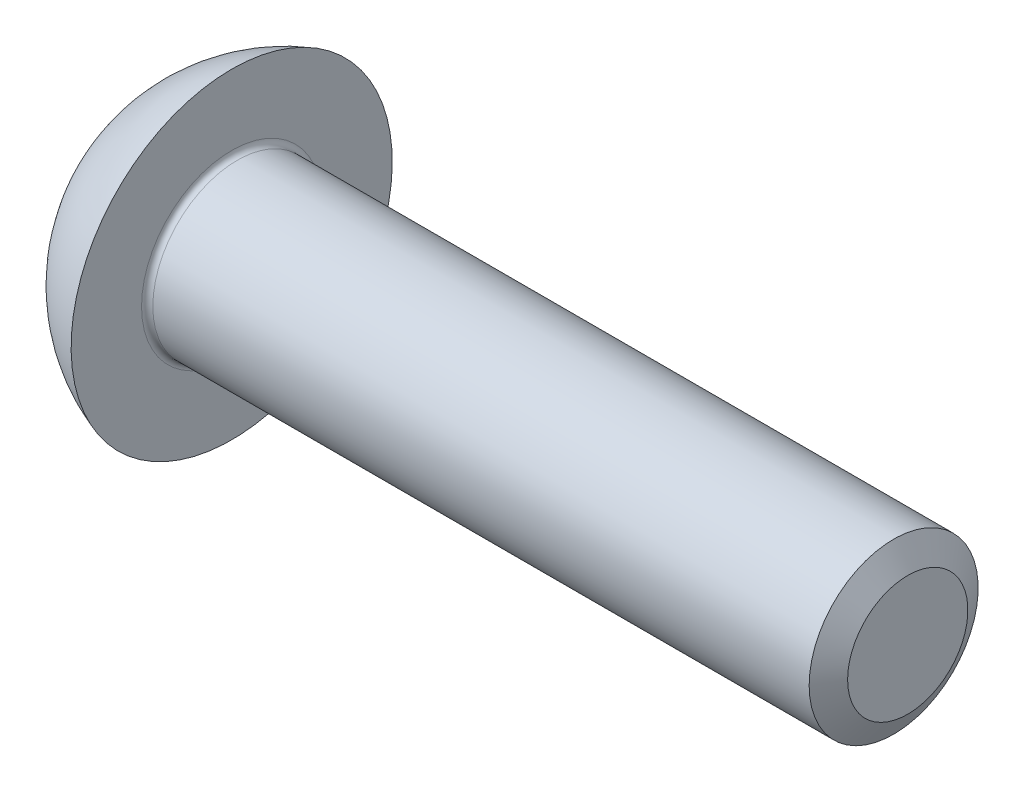
ISO-10303-21;
HEADER;
FILE_DESCRIPTION(('STEP AP214'),'2;1');
FILE_NAME('part.step','',(''),(''),'','','');
FILE_SCHEMA(('AUTOMOTIVE_DESIGN { 1 0 10303 214 1 1 1 1 }'));
ENDSEC;
DATA;
#1=APPLICATION_CONTEXT('core data for automotive mechanical design processes');
#2=APPLICATION_PROTOCOL_DEFINITION('international standard','automotive_design',2000,#1);
#3=PRODUCT_CONTEXT('',#1,'mechanical');
#4=PRODUCT('Part','Part','',(#3));
#5=PRODUCT_RELATED_PRODUCT_CATEGORY('part','',(#4));
#6=PRODUCT_DEFINITION_FORMATION('','',#4);
#7=PRODUCT_DEFINITION_CONTEXT('part definition',#1,'design');
#8=PRODUCT_DEFINITION('design','',#6,#7);
#9=PRODUCT_DEFINITION_SHAPE('','',#8);
#10=(LENGTH_UNIT() NAMED_UNIT(*) SI_UNIT(.MILLI.,.METRE.));
#11=(NAMED_UNIT(*) PLANE_ANGLE_UNIT() SI_UNIT($,.RADIAN.));
#12=(NAMED_UNIT(*) SI_UNIT($,.STERADIAN.) SOLID_ANGLE_UNIT());
#13=UNCERTAINTY_MEASURE_WITH_UNIT(LENGTH_MEASURE(1.E-05),#10,'distance_accuracy_value','');
#14=(GEOMETRIC_REPRESENTATION_CONTEXT(3) GLOBAL_UNCERTAINTY_ASSIGNED_CONTEXT((#13)) GLOBAL_UNIT_ASSIGNED_CONTEXT((#10,
#11,#12)) REPRESENTATION_CONTEXT('',''));
#15=CARTESIAN_POINT('',(0.,0.,0.));
#16=DIRECTION('',(0.,0.,1.));
#17=DIRECTION('',(1.,0.,0.));
#18=AXIS2_PLACEMENT_3D('',#15,#16,#17);
#19=CARTESIAN_POINT('',(-13.65,0.,0.));
#20=DIRECTION('',(-1.,0.,0.));
#21=DIRECTION('',(0.,0.,1.));
#22=AXIS2_PLACEMENT_3D('',#19,#20,#21);
#23=CYLINDRICAL_SURFACE('',#22,1.5);
#24=CARTESIAN_POINT('',(-11.9,0.,0.));
#25=DIRECTION('',(-1.,0.,0.));
#26=DIRECTION('',(0.,0.,1.));
#27=AXIS2_PLACEMENT_3D('',#24,#25,#26);
#28=CIRCLE('',#27,1.5);
#29=CARTESIAN_POINT('',(-11.9,0.,1.5));
#30=VERTEX_POINT('',#29);
#31=EDGE_CURVE('E259',#30,#30,#28,.T.);
#32=ORIENTED_EDGE('',*,*,#31,.F.);
#33=EDGE_LOOP('',(#32));
#34=FACE_BOUND('',#33,.T.);
#35=CARTESIAN_POINT('',(-0.25,0.,0.));
#36=DIRECTION('',(-1.,0.,0.));
#37=DIRECTION('',(0.,0.,1.));
#38=AXIS2_PLACEMENT_3D('',#35,#36,#37);
#39=CIRCLE('',#38,1.5);
#40=CARTESIAN_POINT('',(-0.25,0.,1.5));
#41=VERTEX_POINT('',#40);
#42=EDGE_CURVE('E405',#41,#41,#39,.T.);
#43=ORIENTED_EDGE('',*,*,#42,.T.);
#44=EDGE_LOOP('',(#43));
#45=FACE_BOUND('',#44,.T.);
#46=ADVANCED_FACE('F38',(#34,#45),#23,.T.);
#47=CARTESIAN_POINT('',(-13.65,0.,0.));
#48=DIRECTION('',(1.,0.,0.));
#49=DIRECTION('',(0.,0.,-1.));
#50=AXIS2_PLACEMENT_3D('',#47,#48,#49);
#51=PLANE('',#50);
#52=CARTESIAN_POINT('',(-13.65,0.,0.));
#53=DIRECTION('',(-1.,0.,0.));
#54=DIRECTION('',(0.,0.,1.));
#55=AXIS2_PLACEMENT_3D('',#52,#53,#54);
#56=CIRCLE('',#55,1.5);
#57=CARTESIAN_POINT('',(-13.65,1.5,0.));
#58=VERTEX_POINT('',#57);
#59=EDGE_CURVE('E251',#58,#58,#56,.T.);
#60=ORIENTED_EDGE('',*,*,#59,.T.);
#61=EDGE_LOOP('',(#60));
#62=FACE_BOUND('',#61,.T.);
#63=CARTESIAN_POINT('',(-13.65,0.,0.));
#64=DIRECTION('',(1.,0.,0.));
#65=DIRECTION('',(0.,0.,-1.));
#66=AXIS2_PLACEMENT_3D('',#63,#64,#65);
#67=CIRCLE('',#66,1.15470053837925);
#68=CARTESIAN_POINT('',(-13.65,-0.577350269189626,-1.));
#69=VERTEX_POINT('',#68);
#70=CARTESIAN_POINT('',(-13.65,-1.15470053837925,0.));
#71=VERTEX_POINT('',#70);
#72=EDGE_CURVE('E11',#69,#71,#67,.F.);
#73=ORIENTED_EDGE('',*,*,#72,.F.);
#74=CARTESIAN_POINT('',(-13.65,0.577350269189626,-1.));
#75=VERTEX_POINT('',#74);
#76=EDGE_CURVE('E42',#75,#69,#67,.F.);
#77=ORIENTED_EDGE('',*,*,#76,.F.);
#78=CARTESIAN_POINT('',(-13.65,1.15470053837925,0.));
#79=VERTEX_POINT('',#78);
#80=EDGE_CURVE('E111',#79,#75,#67,.F.);
#81=ORIENTED_EDGE('',*,*,#80,.F.);
#82=CARTESIAN_POINT('',(-13.65,0.,0.));
#83=DIRECTION('',(-1.,0.,0.));
#84=DIRECTION('',(0.,0.,1.));
#85=AXIS2_PLACEMENT_3D('',#82,#83,#84);
#86=CIRCLE('',#85,1.15470053837925);
#87=CARTESIAN_POINT('',(-13.65,0.577350269189627,1.));
#88=VERTEX_POINT('',#87);
#89=EDGE_CURVE('E131',#88,#79,#86,.T.);
#90=ORIENTED_EDGE('',*,*,#89,.F.);
#91=CARTESIAN_POINT('',(-13.65,-0.577350269189627,1.));
#92=VERTEX_POINT('',#91);
#93=EDGE_CURVE('E325',#92,#88,#67,.F.);
#94=ORIENTED_EDGE('',*,*,#93,.F.);
#95=EDGE_CURVE('E47',#71,#92,#67,.F.);
#96=ORIENTED_EDGE('',*,*,#95,.F.);
#97=EDGE_LOOP('',(#73,#77,#81,#90,#94,#96));
#98=FACE_BOUND('',#97,.T.);
#99=ADVANCED_FACE('F40',(#62,#98),#51,.F.);
#100=CARTESIAN_POINT('',(-11.0454545454545,0.,0.));
#101=DIRECTION('',(-1.,0.,0.));
#102=DIRECTION('',(0.,1.,0.));
#103=AXIS2_PLACEMENT_3D('',#100,#101,#102);
#104=SPHERICAL_SURFACE('',#103,3.00560426949281);
#105=CARTESIAN_POINT('',(-12.,0.,0.));
#106=DIRECTION('',(-1.,0.,0.));
#107=DIRECTION('',(0.,0.,1.));
#108=AXIS2_PLACEMENT_3D('',#105,#106,#107);
#109=CIRCLE('',#108,2.85);
#110=CARTESIAN_POINT('',(-12.,2.85,0.));
#111=VERTEX_POINT('',#110);
#112=EDGE_CURVE('E254',#111,#111,#109,.T.);
#113=CARTESIAN_POINT('',(-13.65,1.5,0.));
#114=CARTESIAN_POINT('',(-13.6386705331495,1.51967216925548,0.));
#115=CARTESIAN_POINT('',(-13.6271181108235,1.53921593268643,0.));
#116=CARTESIAN_POINT('',(-13.6035734644196,1.57803672196104,0.));
#117=CARTESIAN_POINT('',(-13.5915812403415,1.59731374780469,0.));
#118=CARTESIAN_POINT('',(-13.5671630996322,1.6355911359664,0.));
#119=CARTESIAN_POINT('',(-13.554737183001,1.65459149828447,0.));
#120=CARTESIAN_POINT('',(-13.5294580495481,1.69230581219271,0.));
#121=CARTESIAN_POINT('',(-13.5166048327265,1.7110197637829,0.));
#122=CARTESIAN_POINT('',(-13.4904776944242,1.74815164624667,0.));
#123=CARTESIAN_POINT('',(-13.4772037729434,1.76656957712027,0.));
#124=CARTESIAN_POINT('',(-13.4502420411911,1.80309996277641,0.));
#125=CARTESIAN_POINT('',(-13.4365542309196,1.82121241755895,0.));
#126=CARTESIAN_POINT('',(-13.4087717487848,1.85712255178676,0.));
#127=CARTESIAN_POINT('',(-13.3946770769215,1.87492023123203,0.));
#128=CARTESIAN_POINT('',(-13.366088108,1.91019167733672,0.));
#129=CARTESIAN_POINT('',(-13.3515938109419,1.92766544399614,0.));
#130=CARTESIAN_POINT('',(-13.3222130331156,1.96228009332959,0.));
#131=CARTESIAN_POINT('',(-13.3073265523475,1.97942097600363,0.));
#132=CARTESIAN_POINT('',(-13.2771690499588,2.013361057086,0.));
#133=CARTESIAN_POINT('',(-13.2618980283382,2.03016025549433,0.));
#134=CARTESIAN_POINT('',(-13.2309792845233,2.06340834318511,0.));
#135=CARTESIAN_POINT('',(-13.2153315623289,2.07985723246756,0.));
#136=CARTESIAN_POINT('',(-13.1836674510477,2.11239625689921,0.));
#137=CARTESIAN_POINT('',(-13.1676510619609,2.12848639204841,0.));
#138=CARTESIAN_POINT('',(-13.1352578398529,2.16029964739354,0.));
#139=CARTESIAN_POINT('',(-13.1188810068317,2.17602276758948,0.));
#140=CARTESIAN_POINT('',(-13.0857753048683,2.2070939206369,0.));
#141=CARTESIAN_POINT('',(-13.069046435926,2.22244195348839,0.));
#142=CARTESIAN_POINT('',(-13.0352452508718,2.25275505202893,0.));
#143=CARTESIAN_POINT('',(-13.01817293476,2.26772011771799,0.));
#144=CARTESIAN_POINT('',(-12.9836936204474,2.29725959873447,0.));
#145=CARTESIAN_POINT('',(-12.9662866222466,2.3118340140619,0.));
#146=CARTESIAN_POINT('',(-12.9311468806653,2.34058471171934,0.));
#147=CARTESIAN_POINT('',(-12.9134141372848,2.35476099404935,0.));
#148=CARTESIAN_POINT('',(-12.8776320094939,2.38270814748122,0.));
#149=CARTESIAN_POINT('',(-12.8595826250834,2.39647901858308,0.));
#150=CARTESIAN_POINT('',(-12.8231764819488,2.42360827946968,0.));
#151=CARTESIAN_POINT('',(-12.8048197232246,2.43696666925442,0.));
#152=CARTESIAN_POINT('',(-12.7678082559874,2.46326410918943,0.));
#153=CARTESIAN_POINT('',(-12.7491535474743,2.4762031593397,0.));
#154=CARTESIAN_POINT('',(-12.7115557581542,2.50165527698115,0.));
#155=CARTESIAN_POINT('',(-12.6926126773472,2.51416834447232,0.));
#156=CARTESIAN_POINT('',(-12.6544478689872,2.53876207247436,0.));
#157=CARTESIAN_POINT('',(-12.6352261414343,2.55084273298524,0.));
#158=CARTESIAN_POINT('',(-12.5965139081898,2.57456544470666,0.));
#159=CARTESIAN_POINT('',(-12.5770234024984,2.5862074959172,0.));
#160=CARTESIAN_POINT('',(-12.5377836195783,2.60904701190566,0.));
#161=CARTESIAN_POINT('',(-12.5180343423497,2.62024447668356,0.));
#162=CARTESIAN_POINT('',(-12.4782871558097,2.6421890709225,0.));
#163=CARTESIAN_POINT('',(-12.4582892464984,2.65293620038353,0.));
#164=CARTESIAN_POINT('',(-12.4180550629064,2.67397460633529,0.));
#165=CARTESIAN_POINT('',(-12.3978187886257,2.68426588282604,0.));
#166=CARTESIAN_POINT('',(-12.3571182645539,2.70438729913089,0.));
#167=CARTESIAN_POINT('',(-12.3366540147628,2.714217438945,0.));
#168=CARTESIAN_POINT('',(-12.2955080462974,2.73341153528513,0.));
#169=CARTESIAN_POINT('',(-12.2748263276231,2.74277549181114,0.));
#170=CARTESIAN_POINT('',(-12.2332560392077,2.7610324130256,0.));
#171=CARTESIAN_POINT('',(-12.2123674694665,2.76992537771405,0.));
#172=CARTESIAN_POINT('',(-12.1703942046549,2.78723575329491,0.));
#173=CARTESIAN_POINT('',(-12.1493095095844,2.79565316418733,0.));
#174=CARTESIAN_POINT('',(-12.1069548141172,2.81200809653373,0.));
#175=CARTESIAN_POINT('',(-12.0856848137203,2.8199456179877,0.));
#176=CARTESIAN_POINT('',(-12.0429704467276,2.83533674876495,0.));
#177=CARTESIAN_POINT('',(-12.0215260801317,2.84279035808822,0.));
#178=CARTESIAN_POINT('',(-12.,2.85,0.));
#179=B_SPLINE_CURVE_WITH_KNOTS('',3,(#113,#114,#115,#116,#117,#118,#119,#120,#121,#122,#123,
#124,#125,#126,#127,#128,#129,#130,#131,#132,#133,#134,#135,#136,#137,#138,#139,#140,#141,#142,
#143,#144,#145,#146,#147,#148,#149,#150,#151,#152,#153,#154,#155,#156,#157,#158,#159,#160,#161,
#162,#163,#164,#165,#166,#167,#168,#169,#170,#171,#172,#173,#174,#175,#176,#177,#178),
.UNSPECIFIED.,.F.,.F.,(4,2,2,2,2,2,2,2,2,2,2,2,2,2,2,2,2,2,2,2,2,2,2,2,2,2,2,2,2,2,2,2,4),(0.,
0.0681025747754092,0.136205149550819,0.204307724326228,0.272410299101639,0.340512873877047,
0.408615448652457,0.476718023427867,0.544820598203277,0.612923172978686,0.681025747754096,
0.749128322529506,0.817230897304916,0.885333472080325,0.953436046855735,1.02153862163114,
1.08964119640655,1.15774377118196,1.22584634595737,1.29394892073278,1.36205149550819,
1.4301540702836,1.49825664505901,1.56635921983442,1.63446179460983,1.70256436938524,
1.77066694416065,1.83876951893606,1.90687209371147,1.97497466848688,2.04307724326229,
2.1111798180377,2.17928239281311),.UNSPECIFIED.);
#180=EDGE_CURVE('BSEAM240',#58,#111,#179,.T.);
#181=ORIENTED_EDGE('',*,*,#59,.F.);
#182=ORIENTED_EDGE('',*,*,#112,.T.);
#183=ORIENTED_EDGE('',*,*,#180,.T.);
#184=ORIENTED_EDGE('',*,*,#180,.F.);
#185=EDGE_LOOP('',(#181,#183,#182,#184));
#186=FACE_BOUND('',#185,.T.);
#187=ADVANCED_FACE('F240',(#186),#104,.T.);
#188=CARTESIAN_POINT('',(-12.,1.6,0.));
#189=DIRECTION('',(-1.,0.,0.));
#190=DIRECTION('',(0.,0.,1.));
#191=AXIS2_PLACEMENT_3D('',#188,#189,#190);
#192=PLANE('',#191);
#193=ORIENTED_EDGE('',*,*,#112,.F.);
#194=EDGE_LOOP('',(#193));
#195=FACE_BOUND('',#194,.T.);
#196=CARTESIAN_POINT('',(-12.,0.,0.));
#197=DIRECTION('',(-1.,0.,0.));
#198=DIRECTION('',(0.,0.,1.));
#199=AXIS2_PLACEMENT_3D('',#196,#197,#198);
#200=CIRCLE('',#199,1.6);
#201=CARTESIAN_POINT('',(-12.,0.,1.6));
#202=VERTEX_POINT('',#201);
#203=EDGE_CURVE('E255',#202,#202,#200,.T.);
#204=ORIENTED_EDGE('',*,*,#203,.T.);
#205=EDGE_LOOP('',(#204));
#206=FACE_BOUND('',#205,.T.);
#207=ADVANCED_FACE('F237',(#195,#206),#192,.F.);
#208=CARTESIAN_POINT('',(-11.9,0.,0.));
#209=DIRECTION('',(-1.,0.,0.));
#210=DIRECTION('',(0.,0.,1.));
#211=AXIS2_PLACEMENT_3D('',#208,#209,#210);
#212=TOROIDAL_SURFACE('',#211,1.6,0.0999999999999998);
#213=ORIENTED_EDGE('',*,*,#203,.F.);
#214=EDGE_LOOP('',(#213));
#215=FACE_BOUND('',#214,.T.);
#216=ORIENTED_EDGE('',*,*,#31,.T.);
#217=EDGE_LOOP('',(#216));
#218=FACE_BOUND('',#217,.T.);
#219=ADVANCED_FACE('F234',(#215,#218),#212,.F.);
#220=CARTESIAN_POINT('',(-13.35,0.,0.));
#221=DIRECTION('',(-1.,0.,0.));
#222=DIRECTION('',(0.,0.,1.));
#223=AXIS2_PLACEMENT_3D('',#220,#221,#222);
#224=CONICAL_SURFACE('',#223,0.,1.31660847419538);
#225=CARTESIAN_POINT('',(-13.8201338062006,-1.50813004514732,-1.));
#226=CARTESIAN_POINT('',(-13.8103550434819,-1.46296169562475,-1.));
#227=CARTESIAN_POINT('',(-13.8007010634544,-1.41776633026118,-1.));
#228=CARTESIAN_POINT('',(-13.7817057249696,-1.32730802014364,-1.));
#229=CARTESIAN_POINT('',(-13.7723643798231,-1.28204507259777,-1.));
#230=CARTESIAN_POINT('',(-13.7448877071242,-1.14605409329119,-1.));
#231=CARTESIAN_POINT('',(-13.7273185934999,-1.05520983561614,-1.));
#232=CARTESIAN_POINT('',(-13.6946113120439,-0.8738383015768,-1.));
#233=CARTESIAN_POINT('',(-13.6794545669247,-0.783314439151701,-1.));
#234=CARTESIAN_POINT('',(-13.6526000869245,-0.601754544959901,-1.));
#235=CARTESIAN_POINT('',(-13.6409016960482,-0.510718613667323,-1.));
#236=CARTESIAN_POINT('',(-13.622468810458,-0.327147289356503,-1.));
#237=CARTESIAN_POINT('',(-13.6157877618807,-0.234606191513627,-1.));
#238=CARTESIAN_POINT('',(-13.6090368362784,-0.0493046545659385,-1.));
#239=CARTESIAN_POINT('',(-13.6089640024597,0.0434556678685453,-1.));
#240=CARTESIAN_POINT('',(-13.6154534934001,0.229083736366359,-1.));
#241=CARTESIAN_POINT('',(-13.622041473699,0.321950511068643,-1.));
#242=CARTESIAN_POINT('',(-13.6404572139982,0.507192547760972,-1.));
#243=CARTESIAN_POINT('',(-13.6522884816261,0.599567438757555,-1.));
#244=CARTESIAN_POINT('',(-13.6798118313239,0.78581137446413,-1.));
#245=CARTESIAN_POINT('',(-13.6955836030873,0.879668211118271,-1.));
#246=CARTESIAN_POINT('',(-13.7295232966955,1.06695285362325,-1.));
#247=CARTESIAN_POINT('',(-13.7476915787428,1.1603805927907,-1.));
#248=CARTESIAN_POINT('',(-13.7855853163259,1.34694314931586,-1.));
#249=CARTESIAN_POINT('',(-13.8053112029955,1.44007787810025,-1.));
#250=CARTESIAN_POINT('',(-13.8457971323176,1.62612272775573,-1.));
#251=CARTESIAN_POINT('',(-13.8665571960826,1.71903284400079,-1.));
#252=CARTESIAN_POINT('',(-13.9085485742872,1.90363742756201,-1.));
#253=CARTESIAN_POINT('',(-13.9297718689361,1.9953337266767,-1.));
#254=CARTESIAN_POINT('',(-13.972714305819,2.17861191613063,-1.));
#255=CARTESIAN_POINT('',(-13.9944334586086,2.27019380399046,-1.));
#256=CARTESIAN_POINT('',(-14.0382042420513,2.45314970808009,-1.));
#257=CARTESIAN_POINT('',(-14.0602553943655,2.5445238389853,-1.));
#258=CARTESIAN_POINT('',(-14.1046332472137,2.72720190611077,-1.));
#259=CARTESIAN_POINT('',(-14.1269599383194,2.81850584461991,-1.));
#260=CARTESIAN_POINT('',(-14.1493826695496,2.90978592155447,-1.));
#261=B_SPLINE_CURVE_WITH_KNOTS('',3,(#225,#226,#227,#228,#229,#230,#231,#232,#233,#234,#235,
#236,#237,#238,#239,#240,#241,#242,#243,#244,#245,#246,#247,#248,#249,#250,#251,#252,#253,#254,
#255,#256,#257,#258,#259,#260),.UNSPECIFIED.,.F.,.F.,(4,2,2,2,2,2,2,2,2,2,2,2,2,2,2,2,2,4),(0.,
0.138643869904216,0.277293635262021,0.554857004575375,0.830167022867763,1.1054247856322,
1.38357462949426,1.66160001678322,1.94070037290082,2.21998772265461,2.50545939054029,
2.79097401465124,3.07656794608524,3.36216771024121,3.64452690734654,3.92689212086078,
4.20888343572446,4.49086512814071),.UNSPECIFIED.);
#262=EDGE_CURVE('E102',#69,#75,#261,.T.);
#263=ORIENTED_EDGE('',*,*,#262,.T.);
#264=ORIENTED_EDGE('',*,*,#76,.T.);
#265=EDGE_LOOP('',(#263,#264));
#266=FACE_BOUND('',#265,.T.);
#267=ADVANCED_FACE('F106',(#266),#224,.F.);
#268=CARTESIAN_POINT('',(-13.6500300044996,0.577234799135788,-1.0002));
#269=CARTESIAN_POINT('',(-13.6437929192042,0.6012250217386,-0.958647715567044));
#270=CARTESIAN_POINT('',(-13.6381313786167,0.625256195021441,-0.917024502475671));
#271=CARTESIAN_POINT('',(-13.6281854217223,0.673398386330439,-0.833639781140785));
#272=CARTESIAN_POINT('',(-13.6239015302713,0.697509431260084,-0.791878226299064));
#273=CARTESIAN_POINT('',(-13.6169589031667,0.745673772514855,-0.708455140132714));
#274=CARTESIAN_POINT('',(-13.6142923745456,0.769726780462717,-0.666794108292159));
#275=CARTESIAN_POINT('',(-13.6107168929941,0.817861664223349,-0.583422044002323));
#276=CARTESIAN_POINT('',(-13.6098076211353,0.841943534003894,-0.541711022001161));
#277=CARTESIAN_POINT('',(-13.6098076211353,0.890107273564984,-0.458288977998838));
#278=CARTESIAN_POINT('',(-13.6107168929941,0.914189143345529,-0.416577955997677));
#279=CARTESIAN_POINT('',(-13.6142923745456,0.962324027106161,-0.333205891707841));
#280=CARTESIAN_POINT('',(-13.6169589031667,0.986377035054023,-0.291544859867286));
#281=CARTESIAN_POINT('',(-13.6239015302713,1.03454137630879,-0.208121773700936));
#282=CARTESIAN_POINT('',(-13.6281854217223,1.05865242123844,-0.166360218859216));
#283=CARTESIAN_POINT('',(-13.6381313786167,1.10679461254744,-0.0829754975243286));
#284=CARTESIAN_POINT('',(-13.6437929192042,1.13082578583028,-0.0413522844329559));
#285=CARTESIAN_POINT('',(-13.6500300044996,1.15481600843309,0.000200000000000079));
#286=B_SPLINE_CURVE_WITH_KNOTS('',3,(#268,#269,#270,#271,#272,#273,#274,#275,#276,#277,#278,
#279,#280,#281,#282,#283,#284,#285),.UNSPECIFIED.,.F.,.F.,(4,2,2,2,2,2,2,2,4),(0.,
0.145159524820137,0.290374287087485,0.434883682122849,0.579366847367631,0.723850012612412,
0.868359407647777,1.01357416991512,1.15873369473526),.UNSPECIFIED.);
#287=EDGE_CURVE('E129',#75,#79,#286,.T.);
#288=ORIENTED_EDGE('',*,*,#287,.T.);
#289=ORIENTED_EDGE('',*,*,#80,.T.);
#290=EDGE_LOOP('',(#288,#289));
#291=FACE_BOUND('',#290,.T.);
#292=ADVANCED_FACE('F158',(#291),#224,.F.);
#293=CARTESIAN_POINT('',(-13.6500300044996,1.15481600843309,-0.000199999999999906));
#294=CARTESIAN_POINT('',(-13.6437929192042,1.13082578583028,0.041352284432956));
#295=CARTESIAN_POINT('',(-13.6381313786167,1.10679461254744,0.0829754975243287));
#296=CARTESIAN_POINT('',(-13.6281854217223,1.05865242123844,0.166360218859215));
#297=CARTESIAN_POINT('',(-13.6239015302713,1.03454137630879,0.208121773700936));
#298=CARTESIAN_POINT('',(-13.6169589031667,0.986377035054023,0.291544859867286));
#299=CARTESIAN_POINT('',(-13.6142923745456,0.962324027106161,0.333205891707841));
#300=CARTESIAN_POINT('',(-13.6107168929941,0.914189143345529,0.416577955997677));
#301=CARTESIAN_POINT('',(-13.6098076211353,0.890107273564984,0.458288977998838));
#302=CARTESIAN_POINT('',(-13.6098076211353,0.841943534003894,0.541711022001161));
#303=CARTESIAN_POINT('',(-13.6107168929941,0.817861664223349,0.583422044002323));
#304=CARTESIAN_POINT('',(-13.6142923745456,0.769726780462718,0.666794108292159));
#305=CARTESIAN_POINT('',(-13.6169589031667,0.745673772514856,0.708455140132714));
#306=CARTESIAN_POINT('',(-13.6239015302713,0.697509431260084,0.791878226299064));
#307=CARTESIAN_POINT('',(-13.6281854217223,0.67339838633044,0.833639781140784));
#308=CARTESIAN_POINT('',(-13.6381313786167,0.625256195021441,0.917024502475671));
#309=CARTESIAN_POINT('',(-13.6437929192042,0.6012250217386,0.958647715567044));
#310=CARTESIAN_POINT('',(-13.6500300044996,0.577234799135789,1.0002));
#311=B_SPLINE_CURVE_WITH_KNOTS('',3,(#293,#294,#295,#296,#297,#298,#299,#300,#301,#302,#303,
#304,#305,#306,#307,#308,#309,#310),.UNSPECIFIED.,.F.,.F.,(4,2,2,2,2,2,2,2,4),(0.,
0.145159524820137,0.290374287087485,0.434883682122849,0.57936684736763,0.723850012612411,
0.868359407647776,1.01357416991512,1.15873369473526),.UNSPECIFIED.);
#312=EDGE_CURVE('E180',#79,#88,#311,.T.);
#313=ORIENTED_EDGE('',*,*,#312,.T.);
#314=ORIENTED_EDGE('',*,*,#89,.T.);
#315=EDGE_LOOP('',(#313,#314));
#316=FACE_BOUND('',#315,.T.);
#317=ADVANCED_FACE('F152',(#316),#224,.F.);
#318=CARTESIAN_POINT('',(-13.8201338062006,-1.50813004514732,1.));
#319=CARTESIAN_POINT('',(-13.8103550434819,-1.46296169562475,1.));
#320=CARTESIAN_POINT('',(-13.8007010634544,-1.41776633026118,1.));
#321=CARTESIAN_POINT('',(-13.7817057249696,-1.32730802014364,1.));
#322=CARTESIAN_POINT('',(-13.7723643798231,-1.28204507259777,1.));
#323=CARTESIAN_POINT('',(-13.7448877071242,-1.14605409329119,1.));
#324=CARTESIAN_POINT('',(-13.7273185934999,-1.05520983561614,1.));
#325=CARTESIAN_POINT('',(-13.6946113120439,-0.8738383015768,1.));
#326=CARTESIAN_POINT('',(-13.6794545669247,-0.783314439151702,1.));
#327=CARTESIAN_POINT('',(-13.6526000869245,-0.601754544959901,1.));
#328=CARTESIAN_POINT('',(-13.6409016960482,-0.510718613667324,1.));
#329=CARTESIAN_POINT('',(-13.622468810458,-0.327147289356504,1.));
#330=CARTESIAN_POINT('',(-13.6157877618807,-0.234606191513628,1.));
#331=CARTESIAN_POINT('',(-13.6090368362784,-0.049304654565939,1.));
#332=CARTESIAN_POINT('',(-13.6089640024597,0.0434556678685448,1.));
#333=CARTESIAN_POINT('',(-13.6154534934001,0.229083736366359,1.));
#334=CARTESIAN_POINT('',(-13.622041473699,0.321950511068643,1.));
#335=CARTESIAN_POINT('',(-13.6404572139982,0.507192547760972,1.));
#336=CARTESIAN_POINT('',(-13.6522884816261,0.599567438757555,1.));
#337=CARTESIAN_POINT('',(-13.6798118313239,0.78581137446413,1.));
#338=CARTESIAN_POINT('',(-13.6955836030873,0.879668211118271,1.));
#339=CARTESIAN_POINT('',(-13.7295232966955,1.06695285362325,1.));
#340=CARTESIAN_POINT('',(-13.7476915787428,1.1603805927907,0.999999999999999));
#341=CARTESIAN_POINT('',(-13.7855853163259,1.34694314931586,0.999999999999999));
#342=CARTESIAN_POINT('',(-13.8053112029955,1.44007787810025,0.999999999999999));
#343=CARTESIAN_POINT('',(-13.8457971323176,1.62612272775573,0.999999999999999));
#344=CARTESIAN_POINT('',(-13.8665571960826,1.71903284400079,0.999999999999999));
#345=CARTESIAN_POINT('',(-13.9085485742872,1.90363742756201,0.999999999999999));
#346=CARTESIAN_POINT('',(-13.9297718689361,1.9953337266767,0.999999999999999));
#347=CARTESIAN_POINT('',(-13.972714305819,2.17861191613064,0.999999999999999));
#348=CARTESIAN_POINT('',(-13.9944334586086,2.27019380399047,0.999999999999999));
#349=CARTESIAN_POINT('',(-14.0382042420513,2.4531497080801,0.999999999999999));
#350=CARTESIAN_POINT('',(-14.0602553943655,2.5445238389853,0.999999999999999));
#351=CARTESIAN_POINT('',(-14.1046332472137,2.72720190611077,0.999999999999999));
#352=CARTESIAN_POINT('',(-14.1269599383194,2.81850584461991,0.999999999999999));
#353=CARTESIAN_POINT('',(-14.1493826695496,2.90978592155447,0.999999999999999));
#354=B_SPLINE_CURVE_WITH_KNOTS('',3,(#318,#319,#320,#321,#322,#323,#324,#325,#326,#327,#328,
#329,#330,#331,#332,#333,#334,#335,#336,#337,#338,#339,#340,#341,#342,#343,#344,#345,#346,#347,
#348,#349,#350,#351,#352,#353),.UNSPECIFIED.,.F.,.F.,(4,2,2,2,2,2,2,2,2,2,2,2,2,2,2,2,2,4),(0.,
0.138643869904216,0.277293635262021,0.554857004575376,0.830167022867763,1.1054247856322,
1.38357462949426,1.66160001678322,1.94070037290082,2.21998772265461,2.50545939054029,
2.79097401465124,3.07656794608524,3.36216771024121,3.64452690734654,3.92689212086078,
4.20888343572447,4.49086512814072),.UNSPECIFIED.);
#355=EDGE_CURVE('E59',#88,#92,#354,.F.);
#356=ORIENTED_EDGE('',*,*,#355,.T.);
#357=ORIENTED_EDGE('',*,*,#93,.T.);
#358=EDGE_LOOP('',(#356,#357));
#359=FACE_BOUND('',#358,.T.);
#360=ADVANCED_FACE('F157',(#359),#224,.F.);
#361=CARTESIAN_POINT('',(-13.6500300044996,-0.577234799135789,1.0002));
#362=CARTESIAN_POINT('',(-13.6437929192042,-0.6012250217386,0.958647715567044));
#363=CARTESIAN_POINT('',(-13.6381313786167,-0.625256195021441,0.917024502475671));
#364=CARTESIAN_POINT('',(-13.6281854217223,-0.67339838633044,0.833639781140784));
#365=CARTESIAN_POINT('',(-13.6239015302713,-0.697509431260084,0.791878226299064));
#366=CARTESIAN_POINT('',(-13.6169589031667,-0.745673772514856,0.708455140132714));
#367=CARTESIAN_POINT('',(-13.6142923745456,-0.769726780462717,0.666794108292159));
#368=CARTESIAN_POINT('',(-13.6107168929941,-0.817861664223349,0.583422044002323));
#369=CARTESIAN_POINT('',(-13.6098076211353,-0.841943534003894,0.541711022001161));
#370=CARTESIAN_POINT('',(-13.6098076211353,-0.890107273564984,0.458288977998838));
#371=CARTESIAN_POINT('',(-13.6107168929941,-0.914189143345529,0.416577955997677));
#372=CARTESIAN_POINT('',(-13.6142923745456,-0.962324027106161,0.33320589170784));
#373=CARTESIAN_POINT('',(-13.6169589031667,-0.986377035054023,0.291544859867286));
#374=CARTESIAN_POINT('',(-13.6239015302713,-1.03454137630879,0.208121773700936));
#375=CARTESIAN_POINT('',(-13.6281854217223,-1.05865242123844,0.166360218859215));
#376=CARTESIAN_POINT('',(-13.6381313786167,-1.10679461254744,0.0829754975243286));
#377=CARTESIAN_POINT('',(-13.6437929192042,-1.13082578583028,0.0413522844329559));
#378=CARTESIAN_POINT('',(-13.6500300044996,-1.15481600843309,-0.000200000000000152));
#379=B_SPLINE_CURVE_WITH_KNOTS('',3,(#361,#362,#363,#364,#365,#366,#367,#368,#369,#370,#371,
#372,#373,#374,#375,#376,#377,#378),.UNSPECIFIED.,.F.,.F.,(4,2,2,2,2,2,2,2,4),(0.,
0.145159524820137,0.290374287087485,0.434883682122849,0.57936684736763,0.723850012612412,
0.868359407647776,1.01357416991512,1.15873369473526),.UNSPECIFIED.);
#380=EDGE_CURVE('E53',#92,#71,#379,.T.);
#381=ORIENTED_EDGE('',*,*,#380,.T.);
#382=ORIENTED_EDGE('',*,*,#95,.T.);
#383=EDGE_LOOP('',(#381,#382));
#384=FACE_BOUND('',#383,.T.);
#385=ADVANCED_FACE('F311',(#384),#224,.F.);
#386=CARTESIAN_POINT('',(-13.6500300044996,-1.15481600843309,0.000199999999999781));
#387=CARTESIAN_POINT('',(-13.6437929192042,-1.13082578583028,-0.0413522844329563));
#388=CARTESIAN_POINT('',(-13.6381313786167,-1.10679461254744,-0.0829754975243289));
#389=CARTESIAN_POINT('',(-13.6281854217223,-1.05865242123844,-0.166360218859216));
#390=CARTESIAN_POINT('',(-13.6239015302713,-1.03454137630879,-0.208121773700936));
#391=CARTESIAN_POINT('',(-13.6169589031667,-0.986377035054023,-0.291544859867286));
#392=CARTESIAN_POINT('',(-13.6142923745456,-0.962324027106161,-0.333205891707841));
#393=CARTESIAN_POINT('',(-13.6107168929941,-0.914189143345529,-0.416577955997677));
#394=CARTESIAN_POINT('',(-13.6098076211353,-0.890107273564984,-0.458288977998839));
#395=CARTESIAN_POINT('',(-13.6098076211353,-0.841943534003894,-0.541711022001162));
#396=CARTESIAN_POINT('',(-13.6107168929941,-0.817861664223349,-0.583422044002323));
#397=CARTESIAN_POINT('',(-13.6142923745456,-0.769726780462717,-0.666794108292159));
#398=CARTESIAN_POINT('',(-13.6169589031667,-0.745673772514855,-0.708455140132714));
#399=CARTESIAN_POINT('',(-13.6239015302713,-0.697509431260084,-0.791878226299064));
#400=CARTESIAN_POINT('',(-13.6281854217223,-0.673398386330439,-0.833639781140784));
#401=CARTESIAN_POINT('',(-13.6381313786167,-0.62525619502144,-0.917024502475671));
#402=CARTESIAN_POINT('',(-13.6437929192042,-0.601225021738599,-0.958647715567044));
#403=CARTESIAN_POINT('',(-13.6500300044996,-0.577234799135788,-1.0002));
#404=B_SPLINE_CURVE_WITH_KNOTS('',3,(#386,#387,#388,#389,#390,#391,#392,#393,#394,#395,#396,
#397,#398,#399,#400,#401,#402,#403),.UNSPECIFIED.,.F.,.F.,(4,2,2,2,2,2,2,2,4),(0.,
0.145159524820137,0.290374287087485,0.434883682122849,0.579366847367631,0.723850012612412,
0.868359407647777,1.01357416991512,1.15873369473526),.UNSPECIFIED.);
#405=EDGE_CURVE('E94',#71,#69,#404,.T.);
#406=ORIENTED_EDGE('',*,*,#405,.T.);
#407=ORIENTED_EDGE('',*,*,#72,.T.);
#408=EDGE_LOOP('',(#406,#407));
#409=FACE_BOUND('',#408,.T.);
#410=ADVANCED_FACE('F96',(#409),#224,.F.);
#411=CARTESIAN_POINT('',(-12.61,0.,0.));
#412=DIRECTION('',(-1.,0.,0.));
#413=DIRECTION('',(0.,0.,1.));
#414=AXIS2_PLACEMENT_3D('',#411,#412,#413);
#415=CONICAL_SURFACE('',#414,1.15470053837925,1.08478502970569);
#416=CARTESIAN_POINT('',(-12.,0.,0.));
#417=VERTEX_POINT('',#416);
#418=VERTEX_LOOP('',#417);
#419=FACE_BOUND('',#418,.T.);
#420=CARTESIAN_POINT('',(-12.9533777684667,-1.50230992902256,1.));
#421=CARTESIAN_POINT('',(-12.9340444770985,-1.45833854212792,1.));
#422=CARTESIAN_POINT('',(-12.9149232468889,-1.41427434371368,1.));
#423=CARTESIAN_POINT('',(-12.8772163060553,-1.32590919945493,1.));
#424=CARTESIAN_POINT('',(-12.8586306831277,-1.28160821623292,1.));
#425=CARTESIAN_POINT('',(-12.8036681479204,-1.14784319746715,1.));
#426=CARTESIAN_POINT('',(-12.7682844805569,-1.0579632127042,1.));
#427=CARTESIAN_POINT('',(-12.7014887266079,-0.876123438303665,1.));
#428=CARTESIAN_POINT('',(-12.6701009938523,-0.784154579064019,1.));
#429=CARTESIAN_POINT('',(-12.6142698926805,-0.598229842536454,1.));
#430=CARTESIAN_POINT('',(-12.5898112637308,-0.50427882924304,1.));
#431=CARTESIAN_POINT('',(-12.561284211295,-0.36166252722494,1.));
#432=CARTESIAN_POINT('',(-12.553133653735,-0.313821896860821,1.));
#433=CARTESIAN_POINT('',(-12.5400901383573,-0.217683951650818,1.));
#434=CARTESIAN_POINT('',(-12.5351973854862,-0.169386608267164,1.));
#435=CARTESIAN_POINT('',(-12.5290689216968,-0.0727543491389219,1.));
#436=CARTESIAN_POINT('',(-12.527818190784,-0.0244204123550067,1.));
#437=CARTESIAN_POINT('',(-12.5290340461975,0.0721832272140567,1.));
#438=CARTESIAN_POINT('',(-12.5314996115443,0.120452943996259,1.));
#439=CARTESIAN_POINT('',(-12.5426858199924,0.247728097144401,1.));
#440=CARTESIAN_POINT('',(-12.5544156263575,0.326472817262408,1.));
#441=CARTESIAN_POINT('',(-12.5853155073682,0.48261102963908,1.));
#442=CARTESIAN_POINT('',(-12.6045054158802,0.560000340271393,1.));
#443=CARTESIAN_POINT('',(-12.6484420950058,0.714868516301326,1.));
#444=CARTESIAN_POINT('',(-12.6732951432692,0.792316418279872,1.));
#445=CARTESIAN_POINT('',(-12.7131493500659,0.90730757594751,1.));
#446=CARTESIAN_POINT('',(-12.7268173024148,0.94532619210618,1.));
#447=CARTESIAN_POINT('',(-12.754876500575,1.02108213746788,1.));
#448=CARTESIAN_POINT('',(-12.7692675114805,1.05881955350961,1.));
#449=CARTESIAN_POINT('',(-12.7839489424249,1.09644387732909,1.));
#450=B_SPLINE_CURVE_WITH_KNOTS('',3,(#420,#421,#422,#423,#424,#425,#426,#427,#428,#429,#430,
#431,#432,#433,#434,#435,#436,#437,#438,#439,#440,#441,#442,#443,#444,#445,#446,#447,#448,#449),
.UNSPECIFIED.,.F.,.F.,(4,2,2,2,2,2,2,2,2,2,2,2,2,2,4),(0.,0.144099688367161,0.288222838023382,
0.577934103063665,0.869334177423657,1.16008739774031,1.30558498623473,1.45109172704164,
1.59599753038748,1.7408635309646,1.97918577008464,2.21814600843203,2.46202630696737,
2.58322416234257,2.70438289467142),.UNSPECIFIED.);
#451=CARTESIAN_POINT('',(-12.61,-0.577350269189626,1.));
#452=VERTEX_POINT('',#451);
#453=CARTESIAN_POINT('',(-12.61,0.577350269189627,1.));
#454=VERTEX_POINT('',#453);
#455=EDGE_CURVE('E196',#452,#454,#450,.T.);
#456=ORIENTED_EDGE('',*,*,#455,.T.);
#457=CARTESIAN_POINT('',(-12.6100610091491,0.577234799135789,1.0002));
#458=CARTESIAN_POINT('',(-12.5967471675624,0.602421402936658,0.956575522546787));
#459=CARTESIAN_POINT('',(-12.5846484366666,0.627789970277025,0.912635874998038));
#460=CARTESIAN_POINT('',(-12.5635159299897,0.678892423428091,0.824123829748984));
#461=CARTESIAN_POINT('',(-12.5544881451853,0.704626922430506,0.77955036996947));
#462=CARTESIAN_POINT('',(-12.5403368995943,0.755829480104157,0.690864938601231));
#463=CARTESIAN_POINT('',(-12.5351365451759,0.781292040133178,0.646762490940193));
#464=CARTESIAN_POINT('',(-12.5287989102245,0.8323219345157,0.558376121164793));
#465=CARTESIAN_POINT('',(-12.527657647587,0.85788914153431,0.514092419600929));
#466=CARTESIAN_POINT('',(-12.5294293203474,0.906140287040706,0.430518984060451));
#467=CARTESIAN_POINT('',(-12.5319054116845,0.92882859971846,0.391221673764573));
#468=CARTESIAN_POINT('',(-12.5399567288674,0.974082594298355,0.312839455906748));
#469=CARTESIAN_POINT('',(-12.5455343304689,0.996648168786445,0.273754734391397));
#470=CARTESIAN_POINT('',(-12.5595556697914,1.04198502975731,0.195228987734174));
#471=CARTESIAN_POINT('',(-12.5680513970794,1.06475218926301,0.155795110726277));
#472=CARTESIAN_POINT('',(-12.5874031221558,1.1099976059254,0.0774277502573925));
#473=CARTESIAN_POINT('',(-12.5982552609432,1.13247627253034,0.0384935576112353));
#474=CARTESIAN_POINT('',(-12.6100610091491,1.15481600843309,-0.000199999999999831));
#475=B_SPLINE_CURVE_WITH_KNOTS('',3,(#457,#458,#459,#460,#461,#462,#463,#464,#465,#466,#467,
#468,#469,#470,#471,#472,#473,#474),.UNSPECIFIED.,.F.,.F.,(4,2,2,2,2,2,2,2,4),(0.,
0.156356652206859,0.313016607627113,0.466436255933325,0.619705352863253,0.755925705289371,
0.892250546480128,1.03114227500706,1.16980823889878),.UNSPECIFIED.);
#476=CARTESIAN_POINT('',(-12.61,1.15470053837925,0.));
#477=VERTEX_POINT('',#476);
#478=EDGE_CURVE('E204',#454,#477,#475,.T.);
#479=ORIENTED_EDGE('',*,*,#478,.T.);
#480=CARTESIAN_POINT('',(-12.6100610091491,1.15481600843309,0.000200000000000064));
#481=CARTESIAN_POINT('',(-12.5967471675624,1.12962940463222,-0.0434244774532125));
#482=CARTESIAN_POINT('',(-12.5846484366666,1.10426083729185,-0.0873641250019612));
#483=CARTESIAN_POINT('',(-12.5635159299897,1.05315838414079,-0.175876170251015));
#484=CARTESIAN_POINT('',(-12.5544881451853,1.02742388513837,-0.220449630030529));
#485=CARTESIAN_POINT('',(-12.5403368995943,0.976221327464722,-0.309135061398768));
#486=CARTESIAN_POINT('',(-12.5351365451759,0.9507587674357,-0.353237509059806));
#487=CARTESIAN_POINT('',(-12.5287989102245,0.899728873053179,-0.441623878835206));
#488=CARTESIAN_POINT('',(-12.527657647587,0.874161666034569,-0.48590758039907));
#489=CARTESIAN_POINT('',(-12.5294293203474,0.825910520528173,-0.569481015939548));
#490=CARTESIAN_POINT('',(-12.5319054116845,0.803222207850419,-0.608778326235427));
#491=CARTESIAN_POINT('',(-12.5399567288674,0.757968213270524,-0.687160544093252));
#492=CARTESIAN_POINT('',(-12.5455343304689,0.735402638782434,-0.726245265608603));
#493=CARTESIAN_POINT('',(-12.5595556697914,0.69006577781157,-0.804771012265826));
#494=CARTESIAN_POINT('',(-12.5680513970794,0.66729861830587,-0.844204889273723));
#495=CARTESIAN_POINT('',(-12.5874031221558,0.622053201643479,-0.922572249742607));
#496=CARTESIAN_POINT('',(-12.5982552609432,0.599574535038539,-0.961506442388765));
#497=CARTESIAN_POINT('',(-12.6100610091491,0.577234799135788,-1.0002));
#498=B_SPLINE_CURVE_WITH_KNOTS('',3,(#480,#481,#482,#483,#484,#485,#486,#487,#488,#489,#490,
#491,#492,#493,#494,#495,#496,#497),.UNSPECIFIED.,.F.,.F.,(4,2,2,2,2,2,2,2,4),(0.,
0.156356652206859,0.313016607627112,0.466436255933324,0.619705352863253,0.755925705289371,
0.892250546480128,1.03114227500706,1.16980823889878),.UNSPECIFIED.);
#499=CARTESIAN_POINT('',(-12.61,0.577350269189626,-1.));
#500=VERTEX_POINT('',#499);
#501=EDGE_CURVE('E112',#477,#500,#498,.T.);
#502=ORIENTED_EDGE('',*,*,#501,.T.);
#503=CARTESIAN_POINT('',(-12.9533777684667,-1.50230992902256,-1.));
#504=CARTESIAN_POINT('',(-12.9340444770985,-1.45833854212792,-1.));
#505=CARTESIAN_POINT('',(-12.9149232468889,-1.41427434371369,-1.));
#506=CARTESIAN_POINT('',(-12.8772163060553,-1.32590919945493,-1.));
#507=CARTESIAN_POINT('',(-12.8586306831277,-1.28160821623293,-1.));
#508=CARTESIAN_POINT('',(-12.8036681479204,-1.14784319746715,-1.));
#509=CARTESIAN_POINT('',(-12.768284480557,-1.0579632127042,-1.));
#510=CARTESIAN_POINT('',(-12.7014887266079,-0.876123438303668,-1.));
#511=CARTESIAN_POINT('',(-12.6701009938523,-0.784154579064021,-1.));
#512=CARTESIAN_POINT('',(-12.6142698926805,-0.598229842536455,-1.));
#513=CARTESIAN_POINT('',(-12.5898112637308,-0.504278829243041,-1.));
#514=CARTESIAN_POINT('',(-12.561284211295,-0.36166252722494,-1.));
#515=CARTESIAN_POINT('',(-12.553133653735,-0.313821896860821,-1.));
#516=CARTESIAN_POINT('',(-12.5400901383573,-0.217683951650818,-1.));
#517=CARTESIAN_POINT('',(-12.5351973854862,-0.169386608267163,-1.));
#518=CARTESIAN_POINT('',(-12.5290689216968,-0.0727543491389211,-1.));
#519=CARTESIAN_POINT('',(-12.527818190784,-0.0244204123550057,-1.));
#520=CARTESIAN_POINT('',(-12.5290340461975,0.072183227214058,-1.));
#521=CARTESIAN_POINT('',(-12.5314996115443,0.12045294399626,-1.));
#522=CARTESIAN_POINT('',(-12.5426858199924,0.247728097144403,-1.));
#523=CARTESIAN_POINT('',(-12.5544156263575,0.32647281726241,-1.));
#524=CARTESIAN_POINT('',(-12.5853155073682,0.482611029639082,-1.));
#525=CARTESIAN_POINT('',(-12.6045054158802,0.560000340271396,-1.));
#526=CARTESIAN_POINT('',(-12.6484420950058,0.714868516301328,-1.));
#527=CARTESIAN_POINT('',(-12.6732951432692,0.792316418279875,-1.));
#528=CARTESIAN_POINT('',(-12.7131493500659,0.907307575947514,-1.));
#529=CARTESIAN_POINT('',(-12.7268173024148,0.945326192106183,-1.));
#530=CARTESIAN_POINT('',(-12.754876500575,1.02108213746788,-1.));
#531=CARTESIAN_POINT('',(-12.7692675114805,1.05881955350962,-1.));
#532=CARTESIAN_POINT('',(-12.7839489424249,1.0964438773291,-1.));
#533=B_SPLINE_CURVE_WITH_KNOTS('',3,(#503,#504,#505,#506,#507,#508,#509,#510,#511,#512,#513,
#514,#515,#516,#517,#518,#519,#520,#521,#522,#523,#524,#525,#526,#527,#528,#529,#530,#531,#532),
.UNSPECIFIED.,.F.,.F.,(4,2,2,2,2,2,2,2,2,2,2,2,2,2,4),(0.,0.144099688367162,0.288222838023382,
0.577934103063665,0.869334177423659,1.16008739774032,1.30558498623474,1.45109172704164,
1.59599753038748,1.74086353096461,1.97918577008465,2.21814600843204,2.46202630696738,
2.58322416234258,2.70438289467143),.UNSPECIFIED.);
#534=CARTESIAN_POINT('',(-12.61,-0.577350269189626,-1.));
#535=VERTEX_POINT('',#534);
#536=EDGE_CURVE('E268',#500,#535,#533,.F.);
#537=ORIENTED_EDGE('',*,*,#536,.T.);
#538=CARTESIAN_POINT('',(-12.6100610091491,-0.577234799135788,-1.0002));
#539=CARTESIAN_POINT('',(-12.5967471675624,-0.602421402936657,-0.956575522546788));
#540=CARTESIAN_POINT('',(-12.5846484366666,-0.627789970277025,-0.912635874998039));
#541=CARTESIAN_POINT('',(-12.5635159299897,-0.67889242342809,-0.824123829748985));
#542=CARTESIAN_POINT('',(-12.5544881451853,-0.704626922430505,-0.779550369969471));
#543=CARTESIAN_POINT('',(-12.5403368995943,-0.755829480104156,-0.690864938601232));
#544=CARTESIAN_POINT('',(-12.5351365451759,-0.781292040133178,-0.646762490940194));
#545=CARTESIAN_POINT('',(-12.5287989102245,-0.832321934515699,-0.558376121164794));
#546=CARTESIAN_POINT('',(-12.527657647587,-0.857889141534309,-0.51409241960093));
#547=CARTESIAN_POINT('',(-12.5294293203474,-0.906140287040705,-0.430518984060452));
#548=CARTESIAN_POINT('',(-12.5319054116845,-0.928828599718459,-0.391221673764574));
#549=CARTESIAN_POINT('',(-12.5399567288674,-0.974082594298354,-0.312839455906749));
#550=CARTESIAN_POINT('',(-12.5455343304689,-0.996648168786444,-0.273754734391398));
#551=CARTESIAN_POINT('',(-12.5595556697914,-1.04198502975731,-0.195228987734175));
#552=CARTESIAN_POINT('',(-12.5680513970794,-1.06475218926301,-0.155795110726278));
#553=CARTESIAN_POINT('',(-12.5874031221558,-1.1099976059254,-0.0774277502573931));
#554=CARTESIAN_POINT('',(-12.5982552609432,-1.13247627253034,-0.0384935576112356));
#555=CARTESIAN_POINT('',(-12.6100610091491,-1.15481600843309,0.000199999999999936));
#556=B_SPLINE_CURVE_WITH_KNOTS('',3,(#538,#539,#540,#541,#542,#543,#544,#545,#546,#547,#548,
#549,#550,#551,#552,#553,#554,#555),.UNSPECIFIED.,.F.,.F.,(4,2,2,2,2,2,2,2,4),(0.,
0.156356652206859,0.313016607627113,0.466436255933325,0.619705352863253,0.755925705289371,
0.892250546480127,1.03114227500706,1.16980823889878),.UNSPECIFIED.);
#557=CARTESIAN_POINT('',(-12.61,-1.15470053837925,0.));
#558=VERTEX_POINT('',#557);
#559=EDGE_CURVE('E119',#535,#558,#556,.T.);
#560=ORIENTED_EDGE('',*,*,#559,.T.);
#561=CARTESIAN_POINT('',(-12.6100610091491,-1.15481600843309,-0.000200000000000164));
#562=CARTESIAN_POINT('',(-12.5967471675624,-1.12962940463222,0.0434244774532124));
#563=CARTESIAN_POINT('',(-12.5846484366666,-1.10426083729185,0.0873641250019613));
#564=CARTESIAN_POINT('',(-12.5635159299897,-1.05315838414079,0.175876170251015));
#565=CARTESIAN_POINT('',(-12.5544881451853,-1.02742388513837,0.220449630030529));
#566=CARTESIAN_POINT('',(-12.5403368995943,-0.976221327464721,0.309135061398768));
#567=CARTESIAN_POINT('',(-12.5351365451759,-0.9507587674357,0.353237509059806));
#568=CARTESIAN_POINT('',(-12.5287989102245,-0.899728873053179,0.441623878835207));
#569=CARTESIAN_POINT('',(-12.527657647587,-0.874161666034569,0.48590758039907));
#570=CARTESIAN_POINT('',(-12.5294293203474,-0.825910520528172,0.569481015939548));
#571=CARTESIAN_POINT('',(-12.5319054116845,-0.803222207850418,0.608778326235427));
#572=CARTESIAN_POINT('',(-12.5399567288674,-0.757968213270523,0.687160544093252));
#573=CARTESIAN_POINT('',(-12.5455343304689,-0.735402638782434,0.726245265608603));
#574=CARTESIAN_POINT('',(-12.5595556697914,-0.69006577781157,0.804771012265826));
#575=CARTESIAN_POINT('',(-12.5680513970794,-0.66729861830587,0.844204889273723));
#576=CARTESIAN_POINT('',(-12.5874031221558,-0.622053201643479,0.922572249742607));
#577=CARTESIAN_POINT('',(-12.5982552609432,-0.59957453503854,0.961506442388765));
#578=CARTESIAN_POINT('',(-12.6100610091491,-0.577234799135789,1.0002));
#579=B_SPLINE_CURVE_WITH_KNOTS('',3,(#561,#562,#563,#564,#565,#566,#567,#568,#569,#570,#571,
#572,#573,#574,#575,#576,#577,#578),.UNSPECIFIED.,.F.,.F.,(4,2,2,2,2,2,2,2,4),(0.,
0.156356652206859,0.313016607627113,0.466436255933325,0.619705352863253,0.755925705289371,
0.892250546480128,1.03114227500706,1.16980823889878),.UNSPECIFIED.);
#580=EDGE_CURVE('E205',#558,#452,#579,.T.);
#581=ORIENTED_EDGE('',*,*,#580,.T.);
#582=EDGE_LOOP('',(#456,#479,#502,#537,#560,#581));
#583=FACE_BOUND('',#582,.T.);
#584=ADVANCED_FACE('F161',(#419,#583),#415,.F.);
#585=CARTESIAN_POINT('',(-12.,1.15470053837925,0.));
#586=DIRECTION('',(0.,0.866025403784439,-0.5));
#587=DIRECTION('',(0.,0.5,0.866025403784439));
#588=AXIS2_PLACEMENT_3D('',#585,#586,#587);
#589=PLANE('',#588);
#590=ORIENTED_EDGE('',*,*,#287,.F.);
#591=DIRECTION('',(-1.,0.,0.));
#592=VECTOR('',#591,1.);
#593=CARTESIAN_POINT('',(-12.,0.577350269189626,-1.));
#594=LINE('',#593,#592);
#595=EDGE_CURVE('E124',#500,#75,#594,.T.);
#596=ORIENTED_EDGE('',*,*,#595,.F.);
#597=ORIENTED_EDGE('',*,*,#501,.F.);
#598=DIRECTION('',(-1.,0.,0.));
#599=VECTOR('',#598,1.);
#600=CARTESIAN_POINT('',(-12.,1.15470053837925,0.));
#601=LINE('',#600,#599);
#602=EDGE_CURVE('E217',#477,#79,#601,.T.);
#603=ORIENTED_EDGE('',*,*,#602,.T.);
#604=EDGE_LOOP('',(#590,#596,#597,#603));
#605=FACE_BOUND('',#604,.T.);
#606=ADVANCED_FACE('F224',(#605),#589,.F.);
#607=CARTESIAN_POINT('',(-12.,0.577350269189626,-1.));
#608=DIRECTION('',(0.,0.,-1.));
#609=DIRECTION('',(0.,1.,0.));
#610=AXIS2_PLACEMENT_3D('',#607,#608,#609);
#611=PLANE('',#610);
#612=ORIENTED_EDGE('',*,*,#262,.F.);
#613=DIRECTION('',(-1.,0.,0.));
#614=VECTOR('',#613,1.);
#615=CARTESIAN_POINT('',(-12.,-0.577350269189626,-1.));
#616=LINE('',#615,#614);
#617=EDGE_CURVE('E116',#535,#69,#616,.T.);
#618=ORIENTED_EDGE('',*,*,#617,.F.);
#619=ORIENTED_EDGE('',*,*,#536,.F.);
#620=ORIENTED_EDGE('',*,*,#595,.T.);
#621=EDGE_LOOP('',(#612,#618,#619,#620));
#622=FACE_BOUND('',#621,.T.);
#623=ADVANCED_FACE('F127',(#622),#611,.F.);
#624=CARTESIAN_POINT('',(-12.,-0.577350269189626,-1.));
#625=DIRECTION('',(0.,-0.866025403784438,-0.5));
#626=DIRECTION('',(0.,0.5,-0.866025403784439));
#627=AXIS2_PLACEMENT_3D('',#624,#625,#626);
#628=PLANE('',#627);
#629=ORIENTED_EDGE('',*,*,#405,.F.);
#630=DIRECTION('',(-1.,0.,0.));
#631=VECTOR('',#630,1.);
#632=CARTESIAN_POINT('',(-12.,-1.15470053837925,0.));
#633=LINE('',#632,#631);
#634=EDGE_CURVE('E123',#558,#71,#633,.T.);
#635=ORIENTED_EDGE('',*,*,#634,.F.);
#636=ORIENTED_EDGE('',*,*,#559,.F.);
#637=ORIENTED_EDGE('',*,*,#617,.T.);
#638=EDGE_LOOP('',(#629,#635,#636,#637));
#639=FACE_BOUND('',#638,.T.);
#640=ADVANCED_FACE('F117',(#639),#628,.F.);
#641=CARTESIAN_POINT('',(-12.,-1.15470053837925,0.));
#642=DIRECTION('',(0.,-0.866025403784439,0.5));
#643=DIRECTION('',(0.,-0.5,-0.866025403784439));
#644=AXIS2_PLACEMENT_3D('',#641,#642,#643);
#645=PLANE('',#644);
#646=ORIENTED_EDGE('',*,*,#380,.F.);
#647=DIRECTION('',(-1.,0.,0.));
#648=VECTOR('',#647,1.);
#649=CARTESIAN_POINT('',(-12.,-0.577350269189626,1.));
#650=LINE('',#649,#648);
#651=EDGE_CURVE('E280',#452,#92,#650,.T.);
#652=ORIENTED_EDGE('',*,*,#651,.F.);
#653=ORIENTED_EDGE('',*,*,#580,.F.);
#654=ORIENTED_EDGE('',*,*,#634,.T.);
#655=EDGE_LOOP('',(#646,#652,#653,#654));
#656=FACE_BOUND('',#655,.T.);
#657=ADVANCED_FACE('F191',(#656),#645,.F.);
#658=CARTESIAN_POINT('',(-12.,-0.577350269189626,1.));
#659=DIRECTION('',(0.,0.,1.));
#660=DIRECTION('',(0.,-1.,0.));
#661=AXIS2_PLACEMENT_3D('',#658,#659,#660);
#662=PLANE('',#661);
#663=ORIENTED_EDGE('',*,*,#355,.F.);
#664=DIRECTION('',(-1.,0.,0.));
#665=VECTOR('',#664,1.);
#666=CARTESIAN_POINT('',(-12.,0.577350269189627,1.));
#667=LINE('',#666,#665);
#668=EDGE_CURVE('E218',#454,#88,#667,.T.);
#669=ORIENTED_EDGE('',*,*,#668,.F.);
#670=ORIENTED_EDGE('',*,*,#455,.F.);
#671=ORIENTED_EDGE('',*,*,#651,.T.);
#672=EDGE_LOOP('',(#663,#669,#670,#671));
#673=FACE_BOUND('',#672,.T.);
#674=ADVANCED_FACE('F187',(#673),#662,.F.);
#675=CARTESIAN_POINT('',(-12.,0.577350269189627,1.));
#676=DIRECTION('',(0.,0.866025403784439,0.5));
#677=DIRECTION('',(0.,-0.5,0.866025403784439));
#678=AXIS2_PLACEMENT_3D('',#675,#676,#677);
#679=PLANE('',#678);
#680=ORIENTED_EDGE('',*,*,#312,.F.);
#681=ORIENTED_EDGE('',*,*,#602,.F.);
#682=ORIENTED_EDGE('',*,*,#478,.F.);
#683=ORIENTED_EDGE('',*,*,#668,.T.);
#684=EDGE_LOOP('',(#680,#681,#682,#683));
#685=FACE_BOUND('',#684,.T.);
#686=ADVANCED_FACE('F190',(#685),#679,.F.);
#687=CARTESIAN_POINT('',(-0.25,0.,0.));
#688=DIRECTION('',(-1.,0.,0.));
#689=DIRECTION('',(0.,0.,1.));
#690=AXIS2_PLACEMENT_3D('',#687,#688,#689);
#691=CONICAL_SURFACE('',#690,1.5,1.0471975511966);
#692=CARTESIAN_POINT('',(0.,0.,0.));
#693=DIRECTION('',(-1.,0.,0.));
#694=DIRECTION('',(0.,0.,1.));
#695=AXIS2_PLACEMENT_3D('',#692,#693,#694);
#696=CIRCLE('',#695,1.06698729810778);
#697=CARTESIAN_POINT('',(0.,0.,1.06698729810778));
#698=VERTEX_POINT('',#697);
#699=EDGE_CURVE('E324',#698,#698,#696,.T.);
#700=ORIENTED_EDGE('',*,*,#699,.T.);
#701=EDGE_LOOP('',(#700));
#702=FACE_BOUND('',#701,.T.);
#703=ORIENTED_EDGE('',*,*,#42,.F.);
#704=EDGE_LOOP('',(#703));
#705=FACE_BOUND('',#704,.T.);
#706=ADVANCED_FACE('F160',(#702,#705),#691,.T.);
#707=CARTESIAN_POINT('',(0.,1.5,0.));
#708=DIRECTION('',(-1.,0.,0.));
#709=DIRECTION('',(0.,0.,1.));
#710=AXIS2_PLACEMENT_3D('',#707,#708,#709);
#711=PLANE('',#710);
#712=ORIENTED_EDGE('',*,*,#699,.F.);
#713=EDGE_LOOP('',(#712));
#714=FACE_BOUND('',#713,.T.);
#715=ADVANCED_FACE('F226',(#714),#711,.F.);
#716=CLOSED_SHELL('',(#46,#99,#187,#207,#219,#267,#292,#317,#360,#385,#410,#584,#606,#623,#640,
#657,#674,#686,#706,#715));
#717=MANIFOLD_SOLID_BREP('B2',#716);
#718=ADVANCED_BREP_SHAPE_REPRESENTATION('',(#18,#717),#14);
#719=SHAPE_DEFINITION_REPRESENTATION(#9,#718);
ENDSEC;
END-ISO-10303-21;
